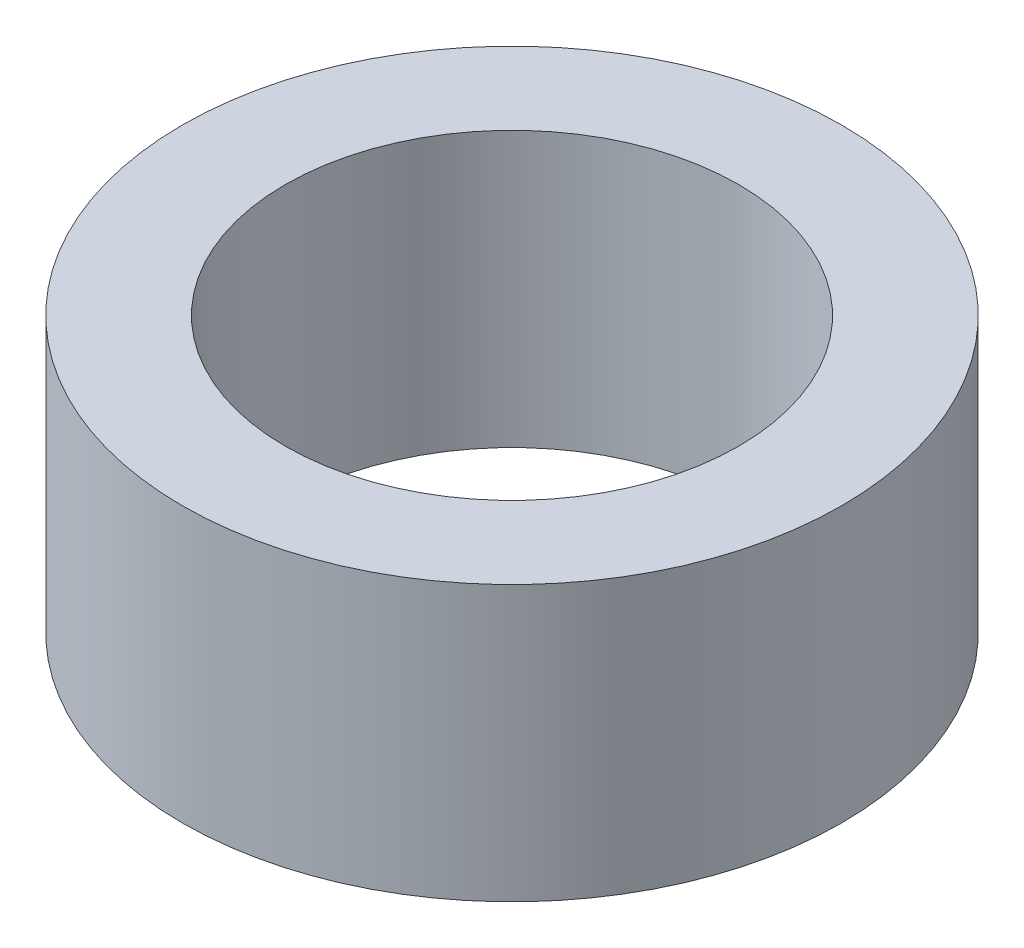
ISO-10303-21;
HEADER;
FILE_DESCRIPTION(('STEP AP214'),'2;1');
FILE_NAME('part.step','',(''),(''),'','','');
FILE_SCHEMA(('AUTOMOTIVE_DESIGN { 1 0 10303 214 1 1 1 1 }'));
ENDSEC;
DATA;
#1=APPLICATION_CONTEXT('core data for automotive mechanical design processes');
#2=APPLICATION_PROTOCOL_DEFINITION('international standard','automotive_design',2000,#1);
#3=PRODUCT_CONTEXT('',#1,'mechanical');
#4=PRODUCT('Part','Part','',(#3));
#5=PRODUCT_RELATED_PRODUCT_CATEGORY('part','',(#4));
#6=PRODUCT_DEFINITION_FORMATION('','',#4);
#7=PRODUCT_DEFINITION_CONTEXT('part definition',#1,'design');
#8=PRODUCT_DEFINITION('design','',#6,#7);
#9=PRODUCT_DEFINITION_SHAPE('','',#8);
#10=(LENGTH_UNIT() NAMED_UNIT(*) SI_UNIT(.MILLI.,.METRE.));
#11=(NAMED_UNIT(*) PLANE_ANGLE_UNIT() SI_UNIT($,.RADIAN.));
#12=(NAMED_UNIT(*) SI_UNIT($,.STERADIAN.) SOLID_ANGLE_UNIT());
#13=UNCERTAINTY_MEASURE_WITH_UNIT(LENGTH_MEASURE(1.E-05),#10,'distance_accuracy_value','');
#14=(GEOMETRIC_REPRESENTATION_CONTEXT(3) GLOBAL_UNCERTAINTY_ASSIGNED_CONTEXT((#13)) GLOBAL_UNIT_ASSIGNED_CONTEXT((#10,
#11,#12)) REPRESENTATION_CONTEXT('',''));
#15=CARTESIAN_POINT('',(0.,0.,0.));
#16=DIRECTION('',(0.,0.,1.));
#17=DIRECTION('',(1.,0.,0.));
#18=AXIS2_PLACEMENT_3D('',#15,#16,#17);
#19=CARTESIAN_POINT('',(0.,2.,0.));
#20=DIRECTION('',(0.,1.,0.));
#21=DIRECTION('',(0.,0.,1.));
#22=AXIS2_PLACEMENT_3D('',#19,#20,#21);
#23=PLANE('',#22);
#24=CARTESIAN_POINT('',(0.,2.,0.));
#25=DIRECTION('',(0.,1.,0.));
#26=DIRECTION('',(0.,0.,1.));
#27=AXIS2_PLACEMENT_3D('',#24,#25,#26);
#28=CIRCLE('',#27,2.4);
#29=CARTESIAN_POINT('',(0.,2.,2.4));
#30=VERTEX_POINT('',#29);
#31=EDGE_CURVE('E10',#30,#30,#28,.T.);
#32=ORIENTED_EDGE('',*,*,#31,.T.);
#33=EDGE_LOOP('',(#32));
#34=FACE_BOUND('',#33,.T.);
#35=CARTESIAN_POINT('',(0.,2.,0.));
#36=DIRECTION('',(0.,1.,0.));
#37=DIRECTION('',(0.,0.,1.));
#38=AXIS2_PLACEMENT_3D('',#35,#36,#37);
#39=CIRCLE('',#38,1.65);
#40=CARTESIAN_POINT('',(0.,2.,1.65));
#41=VERTEX_POINT('',#40);
#42=EDGE_CURVE('E44',#41,#41,#39,.T.);
#43=ORIENTED_EDGE('',*,*,#42,.F.);
#44=EDGE_LOOP('',(#43));
#45=FACE_BOUND('',#44,.T.);
#46=ADVANCED_FACE('F33',(#34,#45),#23,.T.);
#47=CARTESIAN_POINT('',(0.,0.,0.));
#48=DIRECTION('',(0.,1.,0.));
#49=DIRECTION('',(0.,0.,1.));
#50=AXIS2_PLACEMENT_3D('',#47,#48,#49);
#51=PLANE('',#50);
#52=CARTESIAN_POINT('',(0.,0.,0.));
#53=DIRECTION('',(0.,1.,0.));
#54=DIRECTION('',(0.,0.,1.));
#55=AXIS2_PLACEMENT_3D('',#52,#53,#54);
#56=CIRCLE('',#55,2.4);
#57=CARTESIAN_POINT('',(0.,0.,2.4));
#58=VERTEX_POINT('',#57);
#59=EDGE_CURVE('E37',#58,#58,#56,.T.);
#60=ORIENTED_EDGE('',*,*,#59,.F.);
#61=EDGE_LOOP('',(#60));
#62=FACE_BOUND('',#61,.T.);
#63=CARTESIAN_POINT('',(0.,0.,0.));
#64=DIRECTION('',(0.,1.,0.));
#65=DIRECTION('',(0.,0.,1.));
#66=AXIS2_PLACEMENT_3D('',#63,#64,#65);
#67=CIRCLE('',#66,1.65);
#68=CARTESIAN_POINT('',(0.,0.,1.65));
#69=VERTEX_POINT('',#68);
#70=EDGE_CURVE('E46',#69,#69,#67,.T.);
#71=ORIENTED_EDGE('',*,*,#70,.T.);
#72=EDGE_LOOP('',(#71));
#73=FACE_BOUND('',#72,.T.);
#74=ADVANCED_FACE('F56',(#62,#73),#51,.F.);
#75=CARTESIAN_POINT('',(0.,2.,0.));
#76=DIRECTION('',(0.,-1.,0.));
#77=DIRECTION('',(0.,0.,-1.));
#78=AXIS2_PLACEMENT_3D('',#75,#76,#77);
#79=CYLINDRICAL_SURFACE('',#78,2.4);
#80=ORIENTED_EDGE('',*,*,#31,.F.);
#81=EDGE_LOOP('',(#80));
#82=FACE_BOUND('',#81,.T.);
#83=ORIENTED_EDGE('',*,*,#59,.T.);
#84=EDGE_LOOP('',(#83));
#85=FACE_BOUND('',#84,.T.);
#86=ADVANCED_FACE('F35',(#82,#85),#79,.T.);
#87=CARTESIAN_POINT('',(0.,2.,0.));
#88=DIRECTION('',(0.,-1.,0.));
#89=DIRECTION('',(0.,0.,-1.));
#90=AXIS2_PLACEMENT_3D('',#87,#88,#89);
#91=CYLINDRICAL_SURFACE('',#90,1.65);
#92=ORIENTED_EDGE('',*,*,#42,.T.);
#93=EDGE_LOOP('',(#92));
#94=FACE_BOUND('',#93,.T.);
#95=ORIENTED_EDGE('',*,*,#70,.F.);
#96=EDGE_LOOP('',(#95));
#97=FACE_BOUND('',#96,.T.);
#98=ADVANCED_FACE('F52',(#94,#97),#91,.F.);
#99=CLOSED_SHELL('',(#46,#74,#86,#98));
#100=MANIFOLD_SOLID_BREP('B2',#99);
#101=ADVANCED_BREP_SHAPE_REPRESENTATION('',(#18,#100),#14);
#102=SHAPE_DEFINITION_REPRESENTATION(#9,#101);
ENDSEC;
END-ISO-10303-21;
